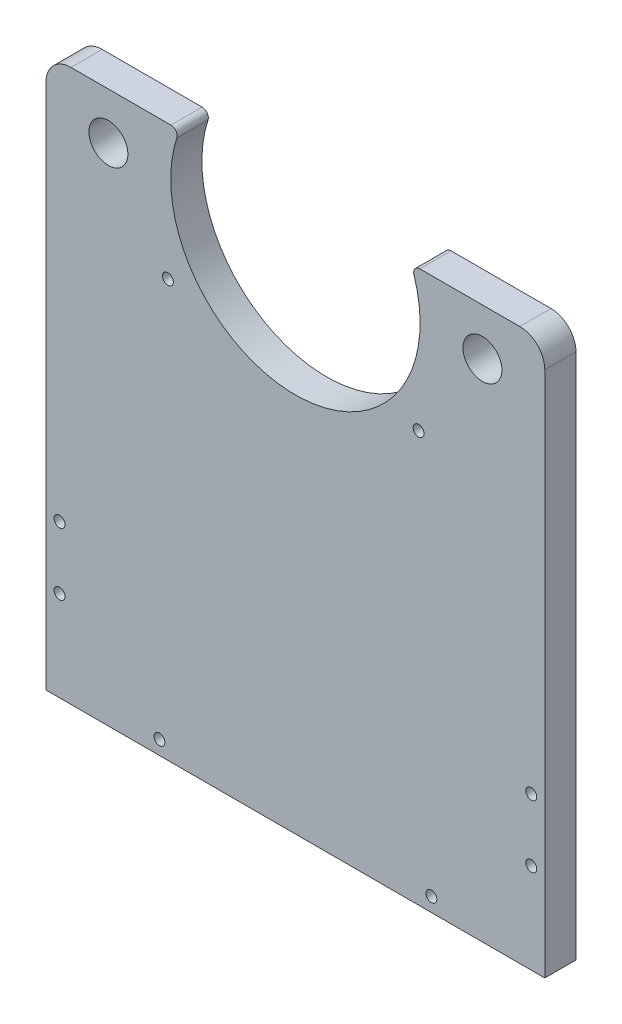
ISO-10303-21;
HEADER;
FILE_DESCRIPTION(('STEP AP214'),'2;1');
FILE_NAME('part.step','',(''),(''),'','','');
FILE_SCHEMA(('AUTOMOTIVE_DESIGN { 1 0 10303 214 1 1 1 1 }'));
ENDSEC;
DATA;
#1=APPLICATION_CONTEXT('core data for automotive mechanical design processes');
#2=APPLICATION_PROTOCOL_DEFINITION('international standard','automotive_design',2000,#1);
#3=PRODUCT_CONTEXT('',#1,'mechanical');
#4=PRODUCT('Part','Part','',(#3));
#5=PRODUCT_RELATED_PRODUCT_CATEGORY('part','',(#4));
#6=PRODUCT_DEFINITION_FORMATION('','',#4);
#7=PRODUCT_DEFINITION_CONTEXT('part definition',#1,'design');
#8=PRODUCT_DEFINITION('design','',#6,#7);
#9=PRODUCT_DEFINITION_SHAPE('','',#8);
#10=(LENGTH_UNIT() NAMED_UNIT(*) SI_UNIT(.MILLI.,.METRE.));
#11=(NAMED_UNIT(*) PLANE_ANGLE_UNIT() SI_UNIT($,.RADIAN.));
#12=(NAMED_UNIT(*) SI_UNIT($,.STERADIAN.) SOLID_ANGLE_UNIT());
#13=UNCERTAINTY_MEASURE_WITH_UNIT(LENGTH_MEASURE(1.E-05),#10,'distance_accuracy_value','');
#14=(GEOMETRIC_REPRESENTATION_CONTEXT(3) GLOBAL_UNCERTAINTY_ASSIGNED_CONTEXT((#13)) GLOBAL_UNIT_ASSIGNED_CONTEXT((#10,
#11,#12)) REPRESENTATION_CONTEXT('',''));
#15=CARTESIAN_POINT('',(0.,0.,0.));
#16=DIRECTION('',(0.,0.,1.));
#17=DIRECTION('',(1.,0.,0.));
#18=AXIS2_PLACEMENT_3D('',#15,#16,#17);
#19=CARTESIAN_POINT('',(80.,162.,10.));
#20=DIRECTION('',(0.,0.,-1.));
#21=DIRECTION('',(-1.,0.,0.));
#22=AXIS2_PLACEMENT_3D('',#19,#20,#21);
#23=CYLINDRICAL_SURFACE('',#22,40.);
#24=CARTESIAN_POINT('',(80.,162.,0.));
#25=DIRECTION('',(0.,0.,1.));
#26=DIRECTION('',(1.,0.,0.));
#27=AXIS2_PLACEMENT_3D('',#24,#25,#26);
#28=CIRCLE('',#27,40.);
#29=CARTESIAN_POINT('',(41.9643322900651,174.380952380952,0.));
#30=VERTEX_POINT('',#29);
#31=CARTESIAN_POINT('',(118.035667709935,174.380952380952,0.));
#32=VERTEX_POINT('',#31);
#33=EDGE_CURVE('E172',#30,#32,#28,.T.);
#34=ORIENTED_EDGE('',*,*,#33,.F.);
#35=DIRECTION('',(0.,0.,-1.));
#36=VECTOR('',#35,1.);
#37=CARTESIAN_POINT('',(41.9643322900651,174.380952380952,10.));
#38=LINE('',#37,#36);
#39=CARTESIAN_POINT('',(41.9643322900651,174.380952380952,10.));
#40=VERTEX_POINT('',#39);
#41=EDGE_CURVE('E11',#40,#30,#38,.T.);
#42=ORIENTED_EDGE('',*,*,#41,.F.);
#43=CARTESIAN_POINT('',(80.,162.,10.));
#44=DIRECTION('',(0.,0.,1.));
#45=DIRECTION('',(1.,0.,0.));
#46=AXIS2_PLACEMENT_3D('',#43,#44,#45);
#47=CIRCLE('',#46,40.);
#48=CARTESIAN_POINT('',(118.035667709935,174.380952380952,10.));
#49=VERTEX_POINT('',#48);
#50=EDGE_CURVE('E345',#40,#49,#47,.T.);
#51=ORIENTED_EDGE('',*,*,#50,.T.);
#52=DIRECTION('',(0.,0.,-1.));
#53=VECTOR('',#52,1.);
#54=CARTESIAN_POINT('',(118.035667709935,174.380952380952,10.));
#55=LINE('',#54,#53);
#56=EDGE_CURVE('E58',#49,#32,#55,.T.);
#57=ORIENTED_EDGE('',*,*,#56,.T.);
#58=EDGE_LOOP('',(#34,#42,#51,#57));
#59=FACE_BOUND('',#58,.T.);
#60=ADVANCED_FACE('F41',(#59),#23,.F.);
#61=CARTESIAN_POINT('',(40.0625489045683,175.,10.));
#62=DIRECTION('',(0.,0.,-1.));
#63=DIRECTION('',(-1.,0.,0.));
#64=AXIS2_PLACEMENT_3D('',#61,#62,#63);
#65=CYLINDRICAL_SURFACE('',#64,2.);
#66=CARTESIAN_POINT('',(40.0625489045683,175.,0.));
#67=DIRECTION('',(0.,0.,1.));
#68=DIRECTION('',(1.,0.,0.));
#69=AXIS2_PLACEMENT_3D('',#66,#67,#68);
#70=CIRCLE('',#69,2.);
#71=CARTESIAN_POINT('',(40.0625489045683,177.,0.));
#72=VERTEX_POINT('',#71);
#73=EDGE_CURVE('E169',#30,#72,#70,.T.);
#74=ORIENTED_EDGE('',*,*,#73,.T.);
#75=DIRECTION('',(0.,0.,-1.));
#76=VECTOR('',#75,1.);
#77=CARTESIAN_POINT('',(40.0625489045683,177.,10.));
#78=LINE('',#77,#76);
#79=CARTESIAN_POINT('',(40.0625489045683,177.,10.));
#80=VERTEX_POINT('',#79);
#81=EDGE_CURVE('E50',#80,#72,#78,.T.);
#82=ORIENTED_EDGE('',*,*,#81,.F.);
#83=CARTESIAN_POINT('',(40.0625489045683,175.,10.));
#84=DIRECTION('',(0.,0.,1.));
#85=DIRECTION('',(1.,0.,0.));
#86=AXIS2_PLACEMENT_3D('',#83,#84,#85);
#87=CIRCLE('',#86,2.);
#88=EDGE_CURVE('E347',#40,#80,#87,.T.);
#89=ORIENTED_EDGE('',*,*,#88,.F.);
#90=ORIENTED_EDGE('',*,*,#41,.T.);
#91=EDGE_LOOP('',(#74,#82,#89,#90));
#92=FACE_BOUND('',#91,.T.);
#93=ADVANCED_FACE('F170',(#92),#65,.T.);
#94=CARTESIAN_POINT('',(0.,177.,10.));
#95=DIRECTION('',(0.,1.,0.));
#96=DIRECTION('',(0.,0.,1.));
#97=AXIS2_PLACEMENT_3D('',#94,#95,#96);
#98=PLANE('',#97);
#99=DIRECTION('',(1.,0.,0.));
#100=VECTOR('',#99,1.);
#101=CARTESIAN_POINT('',(0.,177.,0.));
#102=LINE('',#101,#100);
#103=CARTESIAN_POINT('',(8.00000000000006,177.,0.));
#104=VERTEX_POINT('',#103);
#105=EDGE_CURVE('E163',#104,#72,#102,.T.);
#106=ORIENTED_EDGE('',*,*,#105,.F.);
#107=DIRECTION('',(0.,0.,-1.));
#108=VECTOR('',#107,1.);
#109=CARTESIAN_POINT('',(8.00000000000006,177.,10.));
#110=LINE('',#109,#108);
#111=CARTESIAN_POINT('',(8.00000000000006,177.,10.));
#112=VERTEX_POINT('',#111);
#113=EDGE_CURVE('E155',#112,#104,#110,.T.);
#114=ORIENTED_EDGE('',*,*,#113,.F.);
#115=DIRECTION('',(1.,0.,0.));
#116=VECTOR('',#115,1.);
#117=CARTESIAN_POINT('',(0.,177.,10.));
#118=LINE('',#117,#116);
#119=EDGE_CURVE('E166',#112,#80,#118,.T.);
#120=ORIENTED_EDGE('',*,*,#119,.T.);
#121=ORIENTED_EDGE('',*,*,#81,.T.);
#122=EDGE_LOOP('',(#106,#114,#120,#121));
#123=FACE_BOUND('',#122,.T.);
#124=ADVANCED_FACE('F161',(#123),#98,.T.);
#125=CARTESIAN_POINT('',(8.,169.,10.));
#126=DIRECTION('',(0.,0.,-1.));
#127=DIRECTION('',(-1.,0.,0.));
#128=AXIS2_PLACEMENT_3D('',#125,#126,#127);
#129=CYLINDRICAL_SURFACE('',#128,8.);
#130=CARTESIAN_POINT('',(8.,169.,0.));
#131=DIRECTION('',(0.,0.,1.));
#132=DIRECTION('',(1.,0.,0.));
#133=AXIS2_PLACEMENT_3D('',#130,#131,#132);
#134=CIRCLE('',#133,8.);
#135=CARTESIAN_POINT('',(0.,169.,0.));
#136=VERTEX_POINT('',#135);
#137=EDGE_CURVE('E177',#136,#104,#134,.F.);
#138=ORIENTED_EDGE('',*,*,#137,.F.);
#139=DIRECTION('',(0.,0.,-1.));
#140=VECTOR('',#139,1.);
#141=CARTESIAN_POINT('',(0.,169.,10.));
#142=LINE('',#141,#140);
#143=CARTESIAN_POINT('',(0.,169.,10.));
#144=VERTEX_POINT('',#143);
#145=EDGE_CURVE('E153',#144,#136,#142,.T.);
#146=ORIENTED_EDGE('',*,*,#145,.F.);
#147=CARTESIAN_POINT('',(8.,169.,10.));
#148=DIRECTION('',(0.,0.,1.));
#149=DIRECTION('',(1.,0.,0.));
#150=AXIS2_PLACEMENT_3D('',#147,#148,#149);
#151=CIRCLE('',#150,8.);
#152=EDGE_CURVE('E350',#144,#112,#151,.F.);
#153=ORIENTED_EDGE('',*,*,#152,.T.);
#154=ORIENTED_EDGE('',*,*,#113,.T.);
#155=EDGE_LOOP('',(#138,#146,#153,#154));
#156=FACE_BOUND('',#155,.T.);
#157=ADVANCED_FACE('F371',(#156),#129,.T.);
#158=CARTESIAN_POINT('',(0.,0.,10.));
#159=DIRECTION('',(-1.,0.,0.));
#160=DIRECTION('',(0.,0.,1.));
#161=AXIS2_PLACEMENT_3D('',#158,#159,#160);
#162=PLANE('',#161);
#163=DIRECTION('',(0.,1.,0.));
#164=VECTOR('',#163,1.);
#165=CARTESIAN_POINT('',(0.,0.,0.));
#166=LINE('',#165,#164);
#167=CARTESIAN_POINT('',(0.,0.,0.));
#168=VERTEX_POINT('',#167);
#169=EDGE_CURVE('E179',#168,#136,#166,.T.);
#170=ORIENTED_EDGE('',*,*,#169,.F.);
#171=DIRECTION('',(0.,0.,-1.));
#172=VECTOR('',#171,1.);
#173=CARTESIAN_POINT('',(0.,0.,10.));
#174=LINE('',#173,#172);
#175=CARTESIAN_POINT('',(0.,0.,10.));
#176=VERTEX_POINT('',#175);
#177=EDGE_CURVE('E151',#176,#168,#174,.T.);
#178=ORIENTED_EDGE('',*,*,#177,.F.);
#179=DIRECTION('',(0.,1.,0.));
#180=VECTOR('',#179,1.);
#181=CARTESIAN_POINT('',(0.,0.,10.));
#182=LINE('',#181,#180);
#183=EDGE_CURVE('E353',#176,#144,#182,.T.);
#184=ORIENTED_EDGE('',*,*,#183,.T.);
#185=ORIENTED_EDGE('',*,*,#145,.T.);
#186=EDGE_LOOP('',(#170,#178,#184,#185));
#187=FACE_BOUND('',#186,.T.);
#188=ADVANCED_FACE('F369',(#187),#162,.T.);
#189=CARTESIAN_POINT('',(0.,0.,10.));
#190=DIRECTION('',(0.,1.,0.));
#191=DIRECTION('',(0.,0.,1.));
#192=AXIS2_PLACEMENT_3D('',#189,#190,#191);
#193=PLANE('',#192);
#194=DIRECTION('',(1.,0.,0.));
#195=VECTOR('',#194,1.);
#196=CARTESIAN_POINT('',(0.,0.,0.));
#197=LINE('',#196,#195);
#198=CARTESIAN_POINT('',(160.,0.,0.));
#199=VERTEX_POINT('',#198);
#200=EDGE_CURVE('E184',#168,#199,#197,.T.);
#201=ORIENTED_EDGE('',*,*,#200,.T.);
#202=DIRECTION('',(0.,0.,-1.));
#203=VECTOR('',#202,1.);
#204=CARTESIAN_POINT('',(160.,0.,10.));
#205=LINE('',#204,#203);
#206=CARTESIAN_POINT('',(160.,0.,10.));
#207=VERTEX_POINT('',#206);
#208=EDGE_CURVE('E144',#207,#199,#205,.T.);
#209=ORIENTED_EDGE('',*,*,#208,.F.);
#210=DIRECTION('',(1.,0.,0.));
#211=VECTOR('',#210,1.);
#212=CARTESIAN_POINT('',(0.,0.,10.));
#213=LINE('',#212,#211);
#214=EDGE_CURVE('E356',#176,#207,#213,.T.);
#215=ORIENTED_EDGE('',*,*,#214,.F.);
#216=ORIENTED_EDGE('',*,*,#177,.T.);
#217=EDGE_LOOP('',(#201,#209,#215,#216));
#218=FACE_BOUND('',#217,.T.);
#219=ADVANCED_FACE('F363',(#218),#193,.F.);
#220=CARTESIAN_POINT('',(160.,0.,10.));
#221=DIRECTION('',(-1.,0.,0.));
#222=DIRECTION('',(0.,-1.,0.));
#223=AXIS2_PLACEMENT_3D('',#220,#221,#222);
#224=PLANE('',#223);
#225=DIRECTION('',(0.,1.,0.));
#226=VECTOR('',#225,1.);
#227=CARTESIAN_POINT('',(160.,0.,0.));
#228=LINE('',#227,#226);
#229=CARTESIAN_POINT('',(160.,169.,0.));
#230=VERTEX_POINT('',#229);
#231=EDGE_CURVE('E187',#199,#230,#228,.T.);
#232=ORIENTED_EDGE('',*,*,#231,.T.);
#233=DIRECTION('',(0.,0.,-1.));
#234=VECTOR('',#233,1.);
#235=CARTESIAN_POINT('',(160.,169.,10.));
#236=LINE('',#235,#234);
#237=CARTESIAN_POINT('',(160.,169.,10.));
#238=VERTEX_POINT('',#237);
#239=EDGE_CURVE('E142',#238,#230,#236,.T.);
#240=ORIENTED_EDGE('',*,*,#239,.F.);
#241=DIRECTION('',(0.,1.,0.));
#242=VECTOR('',#241,1.);
#243=CARTESIAN_POINT('',(160.,0.,10.));
#244=LINE('',#243,#242);
#245=EDGE_CURVE('E135',#207,#238,#244,.T.);
#246=ORIENTED_EDGE('',*,*,#245,.F.);
#247=ORIENTED_EDGE('',*,*,#208,.T.);
#248=EDGE_LOOP('',(#232,#240,#246,#247));
#249=FACE_BOUND('',#248,.T.);
#250=ADVANCED_FACE('F366',(#249),#224,.F.);
#251=CARTESIAN_POINT('',(152.,169.,10.));
#252=DIRECTION('',(0.,0.,-1.));
#253=DIRECTION('',(-1.,0.,0.));
#254=AXIS2_PLACEMENT_3D('',#251,#252,#253);
#255=CYLINDRICAL_SURFACE('',#254,8.00000000000001);
#256=CARTESIAN_POINT('',(152.,169.,0.));
#257=DIRECTION('',(0.,0.,1.));
#258=DIRECTION('',(1.,0.,0.));
#259=AXIS2_PLACEMENT_3D('',#256,#257,#258);
#260=CIRCLE('',#259,8.00000000000001);
#261=CARTESIAN_POINT('',(152.,177.,0.));
#262=VERTEX_POINT('',#261);
#263=EDGE_CURVE('E141',#230,#262,#260,.T.);
#264=ORIENTED_EDGE('',*,*,#263,.T.);
#265=DIRECTION('',(0.,0.,-1.));
#266=VECTOR('',#265,1.);
#267=CARTESIAN_POINT('',(152.,177.,10.));
#268=LINE('',#267,#266);
#269=CARTESIAN_POINT('',(152.,177.,10.));
#270=VERTEX_POINT('',#269);
#271=EDGE_CURVE('E124',#270,#262,#268,.T.);
#272=ORIENTED_EDGE('',*,*,#271,.F.);
#273=CARTESIAN_POINT('',(152.,169.,10.));
#274=DIRECTION('',(0.,0.,1.));
#275=DIRECTION('',(1.,0.,0.));
#276=AXIS2_PLACEMENT_3D('',#273,#274,#275);
#277=CIRCLE('',#276,8.00000000000001);
#278=EDGE_CURVE('E129',#238,#270,#277,.T.);
#279=ORIENTED_EDGE('',*,*,#278,.F.);
#280=ORIENTED_EDGE('',*,*,#239,.T.);
#281=EDGE_LOOP('',(#264,#272,#279,#280));
#282=FACE_BOUND('',#281,.T.);
#283=ADVANCED_FACE('F140',(#282),#255,.T.);
#284=CARTESIAN_POINT('',(-1.53523027623947E-13,177.,10.));
#285=DIRECTION('',(0.,-1.,0.));
#286=DIRECTION('',(1.,0.,0.));
#287=AXIS2_PLACEMENT_3D('',#284,#285,#286);
#288=PLANE('',#287);
#289=DIRECTION('',(-1.,0.,0.));
#290=VECTOR('',#289,1.);
#291=CARTESIAN_POINT('',(-1.53523027623947E-13,177.,0.));
#292=LINE('',#291,#290);
#293=CARTESIAN_POINT('',(119.937451095432,177.,0.));
#294=VERTEX_POINT('',#293);
#295=EDGE_CURVE('E191',#262,#294,#292,.T.);
#296=ORIENTED_EDGE('',*,*,#295,.T.);
#297=DIRECTION('',(0.,0.,-1.));
#298=VECTOR('',#297,1.);
#299=CARTESIAN_POINT('',(119.937451095432,177.,10.));
#300=LINE('',#299,#298);
#301=CARTESIAN_POINT('',(119.937451095432,177.,10.));
#302=VERTEX_POINT('',#301);
#303=EDGE_CURVE('E90',#302,#294,#300,.T.);
#304=ORIENTED_EDGE('',*,*,#303,.F.);
#305=DIRECTION('',(-1.,0.,0.));
#306=VECTOR('',#305,1.);
#307=CARTESIAN_POINT('',(-1.53523027623947E-13,177.,10.));
#308=LINE('',#307,#306);
#309=EDGE_CURVE('E120',#270,#302,#308,.T.);
#310=ORIENTED_EDGE('',*,*,#309,.F.);
#311=ORIENTED_EDGE('',*,*,#271,.T.);
#312=EDGE_LOOP('',(#296,#304,#310,#311));
#313=FACE_BOUND('',#312,.T.);
#314=ADVANCED_FACE('F122',(#313),#288,.F.);
#315=CARTESIAN_POINT('',(155.671596304389,28.9999999999999,10.));
#316=DIRECTION('',(0.,0.,-1.));
#317=DIRECTION('',(-1.,0.,0.));
#318=AXIS2_PLACEMENT_3D('',#315,#316,#317);
#319=CYLINDRICAL_SURFACE('',#318,1.74999999999998);
#320=CARTESIAN_POINT('',(155.671596304389,28.9999999999999,10.));
#321=DIRECTION('',(0.,0.,1.));
#322=DIRECTION('',(1.,0.,0.));
#323=AXIS2_PLACEMENT_3D('',#320,#321,#322);
#324=CIRCLE('',#323,1.74999999999998);
#325=CARTESIAN_POINT('',(157.421596304389,28.9999999999999,10.));
#326=VERTEX_POINT('',#325);
#327=EDGE_CURVE('E342',#326,#326,#324,.F.);
#328=ORIENTED_EDGE('',*,*,#327,.F.);
#329=EDGE_LOOP('',(#328));
#330=FACE_BOUND('',#329,.T.);
#331=CARTESIAN_POINT('',(155.671596304389,28.9999999999999,0.));
#332=DIRECTION('',(0.,0.,1.));
#333=DIRECTION('',(1.,0.,0.));
#334=AXIS2_PLACEMENT_3D('',#331,#332,#333);
#335=CIRCLE('',#334,1.74999999999998);
#336=CARTESIAN_POINT('',(157.421596304389,28.9999999999999,0.));
#337=VERTEX_POINT('',#336);
#338=EDGE_CURVE('E220',#337,#337,#335,.F.);
#339=ORIENTED_EDGE('',*,*,#338,.T.);
#340=EDGE_LOOP('',(#339));
#341=FACE_BOUND('',#340,.T.);
#342=ADVANCED_FACE('F243',(#330,#341),#319,.F.);
#343=CARTESIAN_POINT('',(140.,162.,10.));
#344=DIRECTION('',(0.,0.,-1.));
#345=DIRECTION('',(-1.,0.,0.));
#346=AXIS2_PLACEMENT_3D('',#343,#344,#345);
#347=CYLINDRICAL_SURFACE('',#346,6.25);
#348=CARTESIAN_POINT('',(140.,162.,10.));
#349=DIRECTION('',(0.,0.,1.));
#350=DIRECTION('',(1.,0.,0.));
#351=AXIS2_PLACEMENT_3D('',#348,#349,#350);
#352=CIRCLE('',#351,6.25);
#353=CARTESIAN_POINT('',(146.25,162.,10.));
#354=VERTEX_POINT('',#353);
#355=EDGE_CURVE('E339',#354,#354,#352,.F.);
#356=ORIENTED_EDGE('',*,*,#355,.F.);
#357=EDGE_LOOP('',(#356));
#358=FACE_BOUND('',#357,.T.);
#359=CARTESIAN_POINT('',(140.,162.,0.));
#360=DIRECTION('',(0.,0.,1.));
#361=DIRECTION('',(1.,0.,0.));
#362=AXIS2_PLACEMENT_3D('',#359,#360,#361);
#363=CIRCLE('',#362,6.25);
#364=CARTESIAN_POINT('',(146.25,162.,0.));
#365=VERTEX_POINT('',#364);
#366=EDGE_CURVE('E217',#365,#365,#363,.F.);
#367=ORIENTED_EDGE('',*,*,#366,.T.);
#368=EDGE_LOOP('',(#367));
#369=FACE_BOUND('',#368,.T.);
#370=ADVANCED_FACE('F246',(#358,#369),#347,.F.);
#371=CARTESIAN_POINT('',(20.,162.,10.));
#372=DIRECTION('',(0.,0.,-1.));
#373=DIRECTION('',(-1.,0.,0.));
#374=AXIS2_PLACEMENT_3D('',#371,#372,#373);
#375=CYLINDRICAL_SURFACE('',#374,6.25);
#376=CARTESIAN_POINT('',(20.,162.,10.));
#377=DIRECTION('',(0.,0.,1.));
#378=DIRECTION('',(1.,0.,0.));
#379=AXIS2_PLACEMENT_3D('',#376,#377,#378);
#380=CIRCLE('',#379,6.25);
#381=CARTESIAN_POINT('',(26.25,162.,10.));
#382=VERTEX_POINT('',#381);
#383=EDGE_CURVE('E336',#382,#382,#380,.T.);
#384=ORIENTED_EDGE('',*,*,#383,.T.);
#385=EDGE_LOOP('',(#384));
#386=FACE_BOUND('',#385,.T.);
#387=CARTESIAN_POINT('',(20.,162.,0.));
#388=DIRECTION('',(0.,0.,1.));
#389=DIRECTION('',(1.,0.,0.));
#390=AXIS2_PLACEMENT_3D('',#387,#388,#389);
#391=CIRCLE('',#390,6.25);
#392=CARTESIAN_POINT('',(26.25,162.,0.));
#393=VERTEX_POINT('',#392);
#394=EDGE_CURVE('E214',#393,#393,#391,.T.);
#395=ORIENTED_EDGE('',*,*,#394,.F.);
#396=EDGE_LOOP('',(#395));
#397=FACE_BOUND('',#396,.T.);
#398=ADVANCED_FACE('F250',(#386,#397),#375,.F.);
#399=CARTESIAN_POINT('',(4.32840369561144,48.9999999999999,10.));
#400=DIRECTION('',(0.,0.,-1.));
#401=DIRECTION('',(-1.,0.,0.));
#402=AXIS2_PLACEMENT_3D('',#399,#400,#401);
#403=CYLINDRICAL_SURFACE('',#402,1.74999999999997);
#404=CARTESIAN_POINT('',(4.32840369561144,48.9999999999999,10.));
#405=DIRECTION('',(0.,0.,1.));
#406=DIRECTION('',(1.,0.,0.));
#407=AXIS2_PLACEMENT_3D('',#404,#405,#406);
#408=CIRCLE('',#407,1.74999999999997);
#409=CARTESIAN_POINT('',(6.07840369561141,48.9999999999999,10.));
#410=VERTEX_POINT('',#409);
#411=EDGE_CURVE('E333',#410,#410,#408,.T.);
#412=ORIENTED_EDGE('',*,*,#411,.T.);
#413=EDGE_LOOP('',(#412));
#414=FACE_BOUND('',#413,.T.);
#415=CARTESIAN_POINT('',(4.32840369561144,48.9999999999999,0.));
#416=DIRECTION('',(0.,0.,1.));
#417=DIRECTION('',(1.,0.,0.));
#418=AXIS2_PLACEMENT_3D('',#415,#416,#417);
#419=CIRCLE('',#418,1.74999999999997);
#420=CARTESIAN_POINT('',(6.07840369561141,48.9999999999999,0.));
#421=VERTEX_POINT('',#420);
#422=EDGE_CURVE('E211',#421,#421,#419,.T.);
#423=ORIENTED_EDGE('',*,*,#422,.F.);
#424=EDGE_LOOP('',(#423));
#425=FACE_BOUND('',#424,.T.);
#426=ADVANCED_FACE('F254',(#414,#425),#403,.F.);
#427=CARTESIAN_POINT('',(4.32840369561144,28.9999999999999,10.));
#428=DIRECTION('',(0.,0.,-1.));
#429=DIRECTION('',(-1.,0.,0.));
#430=AXIS2_PLACEMENT_3D('',#427,#428,#429);
#431=CYLINDRICAL_SURFACE('',#430,1.75);
#432=CARTESIAN_POINT('',(4.32840369561144,28.9999999999999,10.));
#433=DIRECTION('',(0.,0.,1.));
#434=DIRECTION('',(1.,0.,0.));
#435=AXIS2_PLACEMENT_3D('',#432,#433,#434);
#436=CIRCLE('',#435,1.75);
#437=CARTESIAN_POINT('',(6.07840369561144,28.9999999999999,10.));
#438=VERTEX_POINT('',#437);
#439=EDGE_CURVE('E330',#438,#438,#436,.T.);
#440=ORIENTED_EDGE('',*,*,#439,.T.);
#441=EDGE_LOOP('',(#440));
#442=FACE_BOUND('',#441,.T.);
#443=CARTESIAN_POINT('',(4.32840369561144,28.9999999999999,0.));
#444=DIRECTION('',(0.,0.,1.));
#445=DIRECTION('',(1.,0.,0.));
#446=AXIS2_PLACEMENT_3D('',#443,#444,#445);
#447=CIRCLE('',#446,1.75);
#448=CARTESIAN_POINT('',(6.07840369561144,28.9999999999999,0.));
#449=VERTEX_POINT('',#448);
#450=EDGE_CURVE('E208',#449,#449,#447,.T.);
#451=ORIENTED_EDGE('',*,*,#450,.F.);
#452=EDGE_LOOP('',(#451));
#453=FACE_BOUND('',#452,.T.);
#454=ADVANCED_FACE('F258',(#442,#453),#431,.F.);
#455=CARTESIAN_POINT('',(36.3713027717086,4.49999999999996,10.));
#456=DIRECTION('',(0.,0.,-1.));
#457=DIRECTION('',(-1.,0.,0.));
#458=AXIS2_PLACEMENT_3D('',#455,#456,#457);
#459=CYLINDRICAL_SURFACE('',#458,1.75);
#460=CARTESIAN_POINT('',(36.3713027717086,4.49999999999996,10.));
#461=DIRECTION('',(0.,0.,1.));
#462=DIRECTION('',(1.,0.,0.));
#463=AXIS2_PLACEMENT_3D('',#460,#461,#462);
#464=CIRCLE('',#463,1.75);
#465=CARTESIAN_POINT('',(38.1213027717086,4.49999999999996,10.));
#466=VERTEX_POINT('',#465);
#467=EDGE_CURVE('E327',#466,#466,#464,.T.);
#468=ORIENTED_EDGE('',*,*,#467,.T.);
#469=EDGE_LOOP('',(#468));
#470=FACE_BOUND('',#469,.T.);
#471=CARTESIAN_POINT('',(36.3713027717086,4.49999999999996,0.));
#472=DIRECTION('',(0.,0.,1.));
#473=DIRECTION('',(1.,0.,0.));
#474=AXIS2_PLACEMENT_3D('',#471,#472,#473);
#475=CIRCLE('',#474,1.75);
#476=CARTESIAN_POINT('',(38.1213027717086,4.49999999999996,0.));
#477=VERTEX_POINT('',#476);
#478=EDGE_CURVE('E205',#477,#477,#475,.T.);
#479=ORIENTED_EDGE('',*,*,#478,.F.);
#480=EDGE_LOOP('',(#479));
#481=FACE_BOUND('',#480,.T.);
#482=ADVANCED_FACE('F262',(#470,#481),#459,.F.);
#483=CARTESIAN_POINT('',(123.628697228291,4.49999999999996,10.));
#484=DIRECTION('',(0.,0.,-1.));
#485=DIRECTION('',(-1.,0.,0.));
#486=AXIS2_PLACEMENT_3D('',#483,#484,#485);
#487=CYLINDRICAL_SURFACE('',#486,1.75000000000001);
#488=CARTESIAN_POINT('',(123.628697228291,4.49999999999996,10.));
#489=DIRECTION('',(0.,0.,1.));
#490=DIRECTION('',(1.,0.,0.));
#491=AXIS2_PLACEMENT_3D('',#488,#489,#490);
#492=CIRCLE('',#491,1.75000000000001);
#493=CARTESIAN_POINT('',(125.378697228291,4.49999999999996,10.));
#494=VERTEX_POINT('',#493);
#495=EDGE_CURVE('E273',#494,#494,#492,.F.);
#496=ORIENTED_EDGE('',*,*,#495,.F.);
#497=EDGE_LOOP('',(#496));
#498=FACE_BOUND('',#497,.T.);
#499=CARTESIAN_POINT('',(123.628697228291,4.49999999999996,0.));
#500=DIRECTION('',(0.,0.,1.));
#501=DIRECTION('',(1.,0.,0.));
#502=AXIS2_PLACEMENT_3D('',#499,#500,#501);
#503=CIRCLE('',#502,1.75000000000001);
#504=CARTESIAN_POINT('',(125.378697228291,4.49999999999996,0.));
#505=VERTEX_POINT('',#504);
#506=EDGE_CURVE('E201',#505,#505,#503,.F.);
#507=ORIENTED_EDGE('',*,*,#506,.T.);
#508=EDGE_LOOP('',(#507));
#509=FACE_BOUND('',#508,.T.);
#510=ADVANCED_FACE('F231',(#498,#509),#487,.F.);
#511=CARTESIAN_POINT('',(155.671596304389,48.9999999999999,10.));
#512=DIRECTION('',(0.,0.,-1.));
#513=DIRECTION('',(-1.,0.,0.));
#514=AXIS2_PLACEMENT_3D('',#511,#512,#513);
#515=CYLINDRICAL_SURFACE('',#514,1.74999999999996);
#516=CARTESIAN_POINT('',(155.671596304389,48.9999999999999,10.));
#517=DIRECTION('',(0.,0.,1.));
#518=DIRECTION('',(1.,0.,0.));
#519=AXIS2_PLACEMENT_3D('',#516,#517,#518);
#520=CIRCLE('',#519,1.74999999999996);
#521=CARTESIAN_POINT('',(157.421596304388,48.9999999999999,10.));
#522=VERTEX_POINT('',#521);
#523=EDGE_CURVE('E195',#522,#522,#520,.F.);
#524=ORIENTED_EDGE('',*,*,#523,.F.);
#525=EDGE_LOOP('',(#524));
#526=FACE_BOUND('',#525,.T.);
#527=CARTESIAN_POINT('',(155.671596304389,48.9999999999999,0.));
#528=DIRECTION('',(0.,0.,1.));
#529=DIRECTION('',(1.,0.,0.));
#530=AXIS2_PLACEMENT_3D('',#527,#528,#529);
#531=CIRCLE('',#530,1.74999999999996);
#532=CARTESIAN_POINT('',(157.421596304388,48.9999999999999,0.));
#533=VERTEX_POINT('',#532);
#534=EDGE_CURVE('E198',#533,#533,#531,.F.);
#535=ORIENTED_EDGE('',*,*,#534,.T.);
#536=EDGE_LOOP('',(#535));
#537=FACE_BOUND('',#536,.T.);
#538=ADVANCED_FACE('F43',(#526,#537),#515,.F.);
#539=CARTESIAN_POINT('',(119.937451095432,175.,10.));
#540=DIRECTION('',(0.,0.,-1.));
#541=DIRECTION('',(-1.,0.,0.));
#542=AXIS2_PLACEMENT_3D('',#539,#540,#541);
#543=CYLINDRICAL_SURFACE('',#542,2.);
#544=CARTESIAN_POINT('',(119.937451095432,175.,0.));
#545=DIRECTION('',(0.,0.,1.));
#546=DIRECTION('',(1.,0.,0.));
#547=AXIS2_PLACEMENT_3D('',#544,#545,#546);
#548=CIRCLE('',#547,2.);
#549=EDGE_CURVE('E193',#32,#294,#548,.F.);
#550=ORIENTED_EDGE('',*,*,#549,.F.);
#551=ORIENTED_EDGE('',*,*,#56,.F.);
#552=CARTESIAN_POINT('',(119.937451095432,175.,10.));
#553=DIRECTION('',(0.,0.,1.));
#554=DIRECTION('',(1.,0.,0.));
#555=AXIS2_PLACEMENT_3D('',#552,#553,#554);
#556=CIRCLE('',#555,2.);
#557=EDGE_CURVE('E128',#49,#302,#556,.F.);
#558=ORIENTED_EDGE('',*,*,#557,.T.);
#559=ORIENTED_EDGE('',*,*,#303,.T.);
#560=EDGE_LOOP('',(#550,#551,#558,#559));
#561=FACE_BOUND('',#560,.T.);
#562=ADVANCED_FACE('F222',(#561),#543,.T.);
#563=CARTESIAN_POINT('',(0.,0.,10.));
#564=DIRECTION('',(0.,0.,1.));
#565=DIRECTION('',(1.,0.,0.));
#566=AXIS2_PLACEMENT_3D('',#563,#564,#565);
#567=PLANE('',#566);
#568=CARTESIAN_POINT('',(119.515447902639,131.811991099522,10.));
#569=DIRECTION('',(0.,0.,-1.));
#570=DIRECTION('',(-1.,0.,0.));
#571=AXIS2_PLACEMENT_3D('',#568,#569,#570);
#572=CIRCLE('',#571,1.75000000000001);
#573=CARTESIAN_POINT('',(117.765447902639,131.811991099522,10.));
#574=VERTEX_POINT('',#573);
#575=EDGE_CURVE('E202',#574,#574,#572,.T.);
#576=ORIENTED_EDGE('',*,*,#575,.T.);
#577=EDGE_LOOP('',(#576));
#578=FACE_BOUND('',#577,.T.);
#579=CARTESIAN_POINT('',(39.078552478971,133.747183554463,10.));
#580=DIRECTION('',(0.,0.,-1.));
#581=DIRECTION('',(-1.,0.,0.));
#582=AXIS2_PLACEMENT_3D('',#579,#580,#581);
#583=CIRCLE('',#582,1.75);
#584=CARTESIAN_POINT('',(37.328552478971,133.747183554463,10.));
#585=VERTEX_POINT('',#584);
#586=EDGE_CURVE('E319',#585,#585,#583,.T.);
#587=ORIENTED_EDGE('',*,*,#586,.T.);
#588=EDGE_LOOP('',(#587));
#589=FACE_BOUND('',#588,.T.);
#590=ORIENTED_EDGE('',*,*,#523,.T.);
#591=EDGE_LOOP('',(#590));
#592=FACE_BOUND('',#591,.T.);
#593=ORIENTED_EDGE('',*,*,#495,.T.);
#594=EDGE_LOOP('',(#593));
#595=FACE_BOUND('',#594,.T.);
#596=ORIENTED_EDGE('',*,*,#467,.F.);
#597=EDGE_LOOP('',(#596));
#598=FACE_BOUND('',#597,.T.);
#599=ORIENTED_EDGE('',*,*,#439,.F.);
#600=EDGE_LOOP('',(#599));
#601=FACE_BOUND('',#600,.T.);
#602=ORIENTED_EDGE('',*,*,#411,.F.);
#603=EDGE_LOOP('',(#602));
#604=FACE_BOUND('',#603,.T.);
#605=ORIENTED_EDGE('',*,*,#383,.F.);
#606=EDGE_LOOP('',(#605));
#607=FACE_BOUND('',#606,.T.);
#608=ORIENTED_EDGE('',*,*,#355,.T.);
#609=EDGE_LOOP('',(#608));
#610=FACE_BOUND('',#609,.T.);
#611=ORIENTED_EDGE('',*,*,#327,.T.);
#612=EDGE_LOOP('',(#611));
#613=FACE_BOUND('',#612,.T.);
#614=ORIENTED_EDGE('',*,*,#50,.F.);
#615=ORIENTED_EDGE('',*,*,#88,.T.);
#616=ORIENTED_EDGE('',*,*,#119,.F.);
#617=ORIENTED_EDGE('',*,*,#152,.F.);
#618=ORIENTED_EDGE('',*,*,#183,.F.);
#619=ORIENTED_EDGE('',*,*,#214,.T.);
#620=ORIENTED_EDGE('',*,*,#245,.T.);
#621=ORIENTED_EDGE('',*,*,#278,.T.);
#622=ORIENTED_EDGE('',*,*,#309,.T.);
#623=ORIENTED_EDGE('',*,*,#557,.F.);
#624=EDGE_LOOP('',(#614,#615,#616,#617,#618,#619,#620,#621,#622,#623));
#625=FACE_BOUND('',#624,.T.);
#626=ADVANCED_FACE('F133',(#578,#589,#592,#595,#598,#601,#604,#607,#610,#613,#625),#567,.T.);
#627=CARTESIAN_POINT('',(0.,0.,0.));
#628=DIRECTION('',(0.,0.,1.));
#629=DIRECTION('',(1.,0.,0.));
#630=AXIS2_PLACEMENT_3D('',#627,#628,#629);
#631=PLANE('',#630);
#632=CARTESIAN_POINT('',(119.515447902639,131.811991099522,0.));
#633=DIRECTION('',(0.,0.,-1.));
#634=DIRECTION('',(-1.,0.,0.));
#635=AXIS2_PLACEMENT_3D('',#632,#633,#634);
#636=CIRCLE('',#635,1.75000000000001);
#637=CARTESIAN_POINT('',(117.765447902639,131.811991099522,0.));
#638=VERTEX_POINT('',#637);
#639=EDGE_CURVE('E314',#638,#638,#636,.T.);
#640=ORIENTED_EDGE('',*,*,#639,.F.);
#641=EDGE_LOOP('',(#640));
#642=FACE_BOUND('',#641,.T.);
#643=CARTESIAN_POINT('',(39.078552478971,133.747183554463,0.));
#644=DIRECTION('',(0.,0.,-1.));
#645=DIRECTION('',(-1.,0.,0.));
#646=AXIS2_PLACEMENT_3D('',#643,#644,#645);
#647=CIRCLE('',#646,1.75);
#648=CARTESIAN_POINT('',(37.328552478971,133.747183554463,0.));
#649=VERTEX_POINT('',#648);
#650=EDGE_CURVE('E315',#649,#649,#647,.T.);
#651=ORIENTED_EDGE('',*,*,#650,.F.);
#652=EDGE_LOOP('',(#651));
#653=FACE_BOUND('',#652,.T.);
#654=ORIENTED_EDGE('',*,*,#534,.F.);
#655=EDGE_LOOP('',(#654));
#656=FACE_BOUND('',#655,.T.);
#657=ORIENTED_EDGE('',*,*,#506,.F.);
#658=EDGE_LOOP('',(#657));
#659=FACE_BOUND('',#658,.T.);
#660=ORIENTED_EDGE('',*,*,#478,.T.);
#661=EDGE_LOOP('',(#660));
#662=FACE_BOUND('',#661,.T.);
#663=ORIENTED_EDGE('',*,*,#450,.T.);
#664=EDGE_LOOP('',(#663));
#665=FACE_BOUND('',#664,.T.);
#666=ORIENTED_EDGE('',*,*,#422,.T.);
#667=EDGE_LOOP('',(#666));
#668=FACE_BOUND('',#667,.T.);
#669=ORIENTED_EDGE('',*,*,#394,.T.);
#670=EDGE_LOOP('',(#669));
#671=FACE_BOUND('',#670,.T.);
#672=ORIENTED_EDGE('',*,*,#366,.F.);
#673=EDGE_LOOP('',(#672));
#674=FACE_BOUND('',#673,.T.);
#675=ORIENTED_EDGE('',*,*,#338,.F.);
#676=EDGE_LOOP('',(#675));
#677=FACE_BOUND('',#676,.T.);
#678=ORIENTED_EDGE('',*,*,#33,.T.);
#679=ORIENTED_EDGE('',*,*,#549,.T.);
#680=ORIENTED_EDGE('',*,*,#295,.F.);
#681=ORIENTED_EDGE('',*,*,#263,.F.);
#682=ORIENTED_EDGE('',*,*,#231,.F.);
#683=ORIENTED_EDGE('',*,*,#200,.F.);
#684=ORIENTED_EDGE('',*,*,#169,.T.);
#685=ORIENTED_EDGE('',*,*,#137,.T.);
#686=ORIENTED_EDGE('',*,*,#105,.T.);
#687=ORIENTED_EDGE('',*,*,#73,.F.);
#688=EDGE_LOOP('',(#678,#679,#680,#681,#682,#683,#684,#685,#686,#687));
#689=FACE_BOUND('',#688,.T.);
#690=ADVANCED_FACE('F174',(#642,#653,#656,#659,#662,#665,#668,#671,#674,#677,#689),#631,.F.);
#691=CARTESIAN_POINT('',(39.078552478971,133.747183554463,10.));
#692=DIRECTION('',(0.,0.,-1.));
#693=DIRECTION('',(-1.,0.,0.));
#694=AXIS2_PLACEMENT_3D('',#691,#692,#693);
#695=CYLINDRICAL_SURFACE('',#694,1.75);
#696=ORIENTED_EDGE('',*,*,#586,.F.);
#697=EDGE_LOOP('',(#696));
#698=FACE_BOUND('',#697,.T.);
#699=ORIENTED_EDGE('',*,*,#650,.T.);
#700=EDGE_LOOP('',(#699));
#701=FACE_BOUND('',#700,.T.);
#702=ADVANCED_FACE('F278',(#698,#701),#695,.F.);
#703=CARTESIAN_POINT('',(119.515447902639,131.811991099522,10.));
#704=DIRECTION('',(0.,0.,-1.));
#705=DIRECTION('',(-1.,0.,0.));
#706=AXIS2_PLACEMENT_3D('',#703,#704,#705);
#707=CYLINDRICAL_SURFACE('',#706,1.75000000000001);
#708=ORIENTED_EDGE('',*,*,#575,.F.);
#709=EDGE_LOOP('',(#708));
#710=FACE_BOUND('',#709,.T.);
#711=ORIENTED_EDGE('',*,*,#639,.T.);
#712=EDGE_LOOP('',(#711));
#713=FACE_BOUND('',#712,.T.);
#714=ADVANCED_FACE('F300',(#710,#713),#707,.F.);
#715=CLOSED_SHELL('',(#60,#93,#124,#157,#188,#219,#250,#283,#314,#342,#370,#398,#426,#454,#482,
#510,#538,#562,#626,#690,#702,#714));
#716=MANIFOLD_SOLID_BREP('B2',#715);
#717=ADVANCED_BREP_SHAPE_REPRESENTATION('',(#18,#716),#14);
#718=SHAPE_DEFINITION_REPRESENTATION(#9,#717);
ENDSEC;
END-ISO-10303-21;
